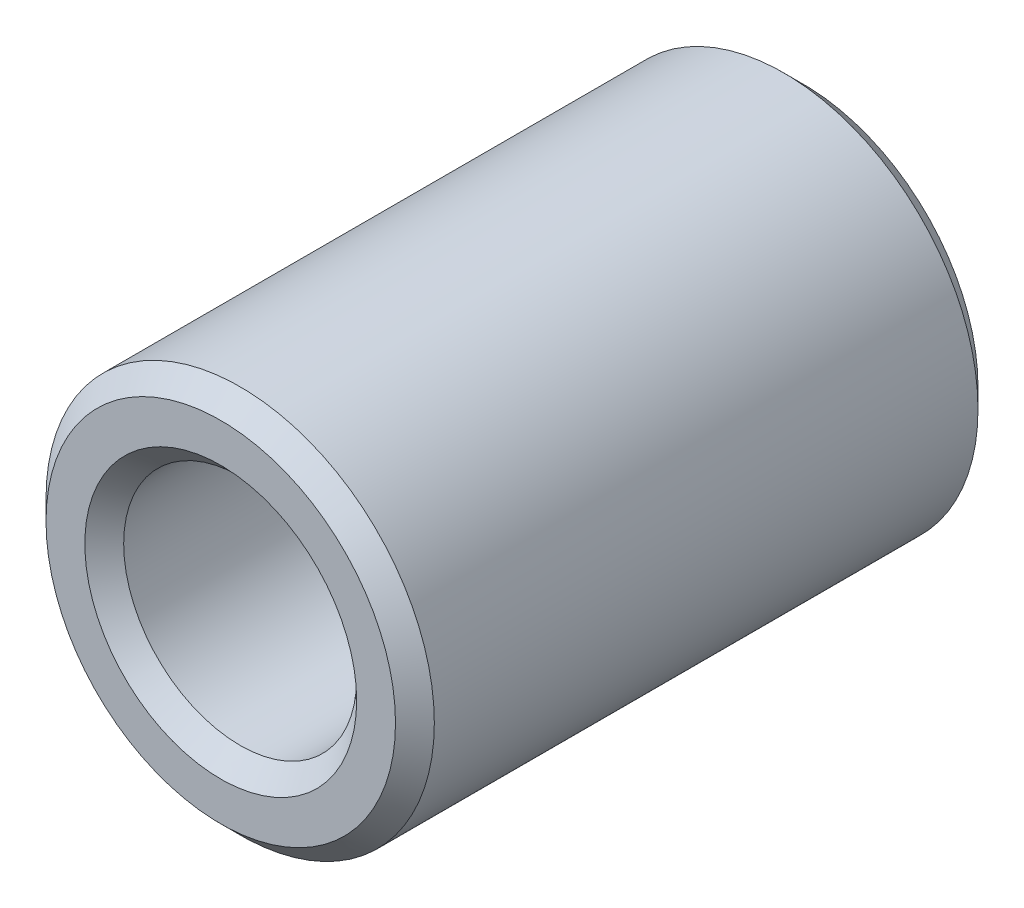
ISO-10303-21;
HEADER;
FILE_DESCRIPTION(('STEP AP214'),'2;1');
FILE_NAME('part.step','',(''),(''),'','','');
FILE_SCHEMA(('AUTOMOTIVE_DESIGN { 1 0 10303 214 1 1 1 1 }'));
ENDSEC;
DATA;
#1=APPLICATION_CONTEXT('core data for automotive mechanical design processes');
#2=APPLICATION_PROTOCOL_DEFINITION('international standard','automotive_design',2000,#1);
#3=PRODUCT_CONTEXT('',#1,'mechanical');
#4=PRODUCT('Part','Part','',(#3));
#5=PRODUCT_RELATED_PRODUCT_CATEGORY('part','',(#4));
#6=PRODUCT_DEFINITION_FORMATION('','',#4);
#7=PRODUCT_DEFINITION_CONTEXT('part definition',#1,'design');
#8=PRODUCT_DEFINITION('design','',#6,#7);
#9=PRODUCT_DEFINITION_SHAPE('','',#8);
#10=(LENGTH_UNIT() NAMED_UNIT(*) SI_UNIT(.MILLI.,.METRE.));
#11=(NAMED_UNIT(*) PLANE_ANGLE_UNIT() SI_UNIT($,.RADIAN.));
#12=(NAMED_UNIT(*) SI_UNIT($,.STERADIAN.) SOLID_ANGLE_UNIT());
#13=UNCERTAINTY_MEASURE_WITH_UNIT(LENGTH_MEASURE(1.E-05),#10,'distance_accuracy_value','');
#14=(GEOMETRIC_REPRESENTATION_CONTEXT(3) GLOBAL_UNCERTAINTY_ASSIGNED_CONTEXT((#13)) GLOBAL_UNIT_ASSIGNED_CONTEXT((#10,
#11,#12)) REPRESENTATION_CONTEXT('',''));
#15=CARTESIAN_POINT('',(0.,0.,0.));
#16=DIRECTION('',(0.,0.,1.));
#17=DIRECTION('',(1.,0.,0.));
#18=AXIS2_PLACEMENT_3D('',#15,#16,#17);
#19=CARTESIAN_POINT('',(0.,0.,15.));
#20=DIRECTION('',(0.,0.,1.));
#21=DIRECTION('',(1.,0.,0.));
#22=AXIS2_PLACEMENT_3D('',#19,#20,#21);
#23=PLANE('',#22);
#24=CARTESIAN_POINT('',(0.,0.,15.));
#25=DIRECTION('',(0.,0.,1.));
#26=DIRECTION('',(1.,0.,0.));
#27=AXIS2_PLACEMENT_3D('',#24,#25,#26);
#28=CIRCLE('',#27,3.5);
#29=CARTESIAN_POINT('',(3.5,0.,15.));
#30=VERTEX_POINT('',#29);
#31=EDGE_CURVE('E10',#30,#30,#28,.F.);
#32=ORIENTED_EDGE('',*,*,#31,.T.);
#33=EDGE_LOOP('',(#32));
#34=FACE_BOUND('',#33,.T.);
#35=CARTESIAN_POINT('',(0.,0.,15.));
#36=DIRECTION('',(0.,0.,1.));
#37=DIRECTION('',(1.,0.,0.));
#38=AXIS2_PLACEMENT_3D('',#35,#36,#37);
#39=CIRCLE('',#38,4.5);
#40=CARTESIAN_POINT('',(4.5,0.,15.));
#41=VERTEX_POINT('',#40);
#42=EDGE_CURVE('E44',#41,#41,#39,.T.);
#43=ORIENTED_EDGE('',*,*,#42,.T.);
#44=EDGE_LOOP('',(#43));
#45=FACE_BOUND('',#44,.T.);
#46=ADVANCED_FACE('F36',(#34,#45),#23,.T.);
#47=CARTESIAN_POINT('',(0.,0.,0.));
#48=DIRECTION('',(0.,0.,1.));
#49=DIRECTION('',(1.,0.,0.));
#50=AXIS2_PLACEMENT_3D('',#47,#48,#49);
#51=PLANE('',#50);
#52=CARTESIAN_POINT('',(0.,0.,0.));
#53=DIRECTION('',(0.,0.,1.));
#54=DIRECTION('',(1.,0.,0.));
#55=AXIS2_PLACEMENT_3D('',#52,#53,#54);
#56=CIRCLE('',#55,3.5);
#57=CARTESIAN_POINT('',(3.5,0.,0.));
#58=VERTEX_POINT('',#57);
#59=EDGE_CURVE('E63',#58,#58,#56,.T.);
#60=ORIENTED_EDGE('',*,*,#59,.T.);
#61=EDGE_LOOP('',(#60));
#62=FACE_BOUND('',#61,.T.);
#63=CARTESIAN_POINT('',(0.,0.,0.));
#64=DIRECTION('',(0.,0.,1.));
#65=DIRECTION('',(1.,0.,0.));
#66=AXIS2_PLACEMENT_3D('',#63,#64,#65);
#67=CIRCLE('',#66,4.5);
#68=CARTESIAN_POINT('',(4.5,0.,0.));
#69=VERTEX_POINT('',#68);
#70=EDGE_CURVE('E66',#69,#69,#67,.F.);
#71=ORIENTED_EDGE('',*,*,#70,.T.);
#72=EDGE_LOOP('',(#71));
#73=FACE_BOUND('',#72,.T.);
#74=ADVANCED_FACE('F70',(#62,#73),#51,.F.);
#75=CARTESIAN_POINT('',(0.,0.,15.));
#76=DIRECTION('',(0.,0.,-1.));
#77=DIRECTION('',(-1.,0.,0.));
#78=AXIS2_PLACEMENT_3D('',#75,#76,#77);
#79=CYLINDRICAL_SURFACE('',#78,5.);
#80=CARTESIAN_POINT('',(0.,0.,0.499999999999997));
#81=DIRECTION('',(0.,0.,1.));
#82=DIRECTION('',(1.,0.,0.));
#83=AXIS2_PLACEMENT_3D('',#80,#81,#82);
#84=CIRCLE('',#83,5.);
#85=CARTESIAN_POINT('',(5.,0.,0.499999999999997));
#86=VERTEX_POINT('',#85);
#87=EDGE_CURVE('E48',#86,#86,#84,.T.);
#88=ORIENTED_EDGE('',*,*,#87,.T.);
#89=EDGE_LOOP('',(#88));
#90=FACE_BOUND('',#89,.T.);
#91=CARTESIAN_POINT('',(0.,0.,14.5));
#92=DIRECTION('',(0.,0.,1.));
#93=DIRECTION('',(1.,0.,0.));
#94=AXIS2_PLACEMENT_3D('',#91,#92,#93);
#95=CIRCLE('',#94,5.);
#96=CARTESIAN_POINT('',(5.,0.,14.5));
#97=VERTEX_POINT('',#96);
#98=EDGE_CURVE('E52',#97,#97,#95,.F.);
#99=ORIENTED_EDGE('',*,*,#98,.T.);
#100=EDGE_LOOP('',(#99));
#101=FACE_BOUND('',#100,.T.);
#102=ADVANCED_FACE('F80',(#90,#101),#79,.T.);
#103=CARTESIAN_POINT('',(0.,0.,15.));
#104=DIRECTION('',(0.,0.,-1.));
#105=DIRECTION('',(-1.,0.,0.));
#106=AXIS2_PLACEMENT_3D('',#103,#104,#105);
#107=CYLINDRICAL_SURFACE('',#106,3.);
#108=CARTESIAN_POINT('',(0.,0.,0.500000000000002));
#109=DIRECTION('',(0.,0.,1.));
#110=DIRECTION('',(1.,0.,0.));
#111=AXIS2_PLACEMENT_3D('',#108,#109,#110);
#112=CIRCLE('',#111,3.);
#113=CARTESIAN_POINT('',(3.,0.,0.500000000000002));
#114=VERTEX_POINT('',#113);
#115=EDGE_CURVE('E57',#114,#114,#112,.F.);
#116=ORIENTED_EDGE('',*,*,#115,.T.);
#117=EDGE_LOOP('',(#116));
#118=FACE_BOUND('',#117,.T.);
#119=CARTESIAN_POINT('',(0.,0.,14.5));
#120=DIRECTION('',(0.,0.,1.));
#121=DIRECTION('',(1.,0.,0.));
#122=AXIS2_PLACEMENT_3D('',#119,#120,#121);
#123=CIRCLE('',#122,3.);
#124=CARTESIAN_POINT('',(3.,0.,14.5));
#125=VERTEX_POINT('',#124);
#126=EDGE_CURVE('E60',#125,#125,#123,.T.);
#127=ORIENTED_EDGE('',*,*,#126,.T.);
#128=EDGE_LOOP('',(#127));
#129=FACE_BOUND('',#128,.T.);
#130=ADVANCED_FACE('F83',(#118,#129),#107,.F.);
#131=CARTESIAN_POINT('',(0.,0.,0.));
#132=DIRECTION('',(0.,0.,-1.));
#133=DIRECTION('',(-1.,0.,0.));
#134=AXIS2_PLACEMENT_3D('',#131,#132,#133);
#135=CONICAL_SURFACE('',#134,3.5,0.785398163397446);
#136=ORIENTED_EDGE('',*,*,#115,.F.);
#137=EDGE_LOOP('',(#136));
#138=FACE_BOUND('',#137,.T.);
#139=ORIENTED_EDGE('',*,*,#59,.F.);
#140=EDGE_LOOP('',(#139));
#141=FACE_BOUND('',#140,.T.);
#142=ADVANCED_FACE('F76',(#138,#141),#135,.F.);
#143=CARTESIAN_POINT('',(0.,0.,0.499999999999997));
#144=DIRECTION('',(0.,0.,1.));
#145=DIRECTION('',(1.,0.,0.));
#146=AXIS2_PLACEMENT_3D('',#143,#144,#145);
#147=CONICAL_SURFACE('',#146,5.,0.785398163397451);
#148=ORIENTED_EDGE('',*,*,#70,.F.);
#149=EDGE_LOOP('',(#148));
#150=FACE_BOUND('',#149,.T.);
#151=ORIENTED_EDGE('',*,*,#87,.F.);
#152=EDGE_LOOP('',(#151));
#153=FACE_BOUND('',#152,.T.);
#154=ADVANCED_FACE('F72',(#150,#153),#147,.T.);
#155=CARTESIAN_POINT('',(0.,0.,14.5));
#156=DIRECTION('',(0.,0.,1.));
#157=DIRECTION('',(1.,0.,0.));
#158=AXIS2_PLACEMENT_3D('',#155,#156,#157);
#159=CONICAL_SURFACE('',#158,3.,0.78539816339745);
#160=ORIENTED_EDGE('',*,*,#31,.F.);
#161=EDGE_LOOP('',(#160));
#162=FACE_BOUND('',#161,.T.);
#163=ORIENTED_EDGE('',*,*,#126,.F.);
#164=EDGE_LOOP('',(#163));
#165=FACE_BOUND('',#164,.T.);
#166=ADVANCED_FACE('F75',(#162,#165),#159,.F.);
#167=CARTESIAN_POINT('',(0.,0.,15.));
#168=DIRECTION('',(0.,0.,-1.));
#169=DIRECTION('',(-1.,0.,0.));
#170=AXIS2_PLACEMENT_3D('',#167,#168,#169);
#171=CONICAL_SURFACE('',#170,4.5,0.785398163397444);
#172=ORIENTED_EDGE('',*,*,#98,.F.);
#173=EDGE_LOOP('',(#172));
#174=FACE_BOUND('',#173,.T.);
#175=ORIENTED_EDGE('',*,*,#42,.F.);
#176=EDGE_LOOP('',(#175));
#177=FACE_BOUND('',#176,.T.);
#178=ADVANCED_FACE('F39',(#174,#177),#171,.T.);
#179=CLOSED_SHELL('',(#46,#74,#102,#130,#142,#154,#166,#178));
#180=MANIFOLD_SOLID_BREP('B2',#179);
#181=ADVANCED_BREP_SHAPE_REPRESENTATION('',(#18,#180),#14);
#182=SHAPE_DEFINITION_REPRESENTATION(#9,#181);
ENDSEC;
END-ISO-10303-21;
